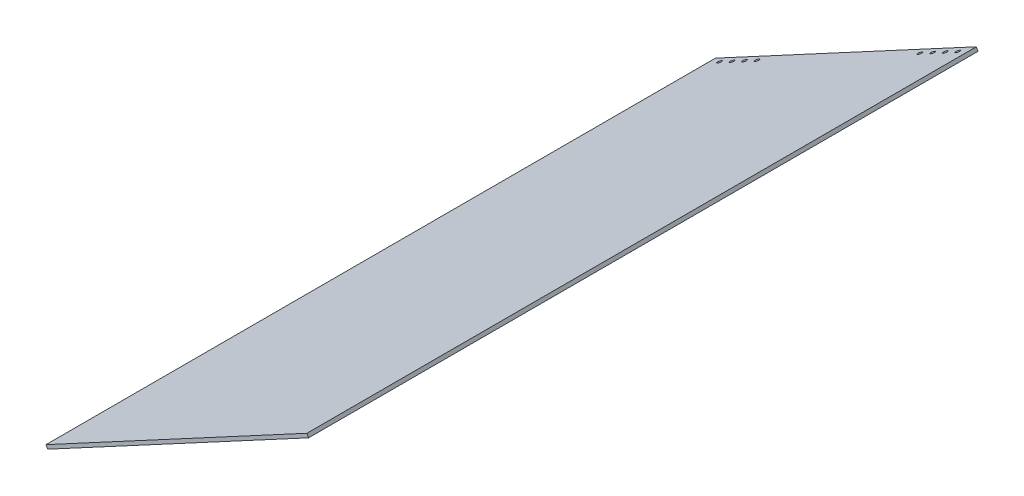
ISO-10303-21;
HEADER;
FILE_DESCRIPTION(('STEP AP214'),'2;1');
FILE_NAME('part.step','',(''),(''),'','','');
FILE_SCHEMA(('AUTOMOTIVE_DESIGN { 1 0 10303 214 1 1 1 1 }'));
ENDSEC;
DATA;
#1=APPLICATION_CONTEXT('core data for automotive mechanical design processes');
#2=APPLICATION_PROTOCOL_DEFINITION('international standard','automotive_design',2000,#1);
#3=PRODUCT_CONTEXT('',#1,'mechanical');
#4=PRODUCT('Part','Part','',(#3));
#5=PRODUCT_RELATED_PRODUCT_CATEGORY('part','',(#4));
#6=PRODUCT_DEFINITION_FORMATION('','',#4);
#7=PRODUCT_DEFINITION_CONTEXT('part definition',#1,'design');
#8=PRODUCT_DEFINITION('design','',#6,#7);
#9=PRODUCT_DEFINITION_SHAPE('','',#8);
#10=(LENGTH_UNIT() NAMED_UNIT(*) SI_UNIT(.MILLI.,.METRE.));
#11=(NAMED_UNIT(*) PLANE_ANGLE_UNIT() SI_UNIT($,.RADIAN.));
#12=(NAMED_UNIT(*) SI_UNIT($,.STERADIAN.) SOLID_ANGLE_UNIT());
#13=UNCERTAINTY_MEASURE_WITH_UNIT(LENGTH_MEASURE(1.E-05),#10,'distance_accuracy_value','');
#14=(GEOMETRIC_REPRESENTATION_CONTEXT(3) GLOBAL_UNCERTAINTY_ASSIGNED_CONTEXT((#13)) GLOBAL_UNIT_ASSIGNED_CONTEXT((#10,
#11,#12)) REPRESENTATION_CONTEXT('',''));
#15=CARTESIAN_POINT('',(0.,0.,0.));
#16=DIRECTION('',(0.,0.,1.));
#17=DIRECTION('',(1.,0.,0.));
#18=AXIS2_PLACEMENT_3D('',#15,#16,#17);
#19=CARTESIAN_POINT('',(-84.4308480260664,85.5814821604404,596.9));
#20=DIRECTION('',(0.880733896749151,0.473611447409219,0.));
#21=DIRECTION('',(-0.473611447409219,0.880733896749151,0.));
#22=AXIS2_PLACEMENT_3D('',#19,#20,#21);
#23=PLANE('',#22);
#24=DIRECTION('',(0.473611447409219,-0.880733896749151,0.));
#25=VECTOR('',#24,1.);
#26=CARTESIAN_POINT('',(-84.4308480260664,85.5814821604404,0.));
#27=LINE('',#26,#25);
#28=CARTESIAN_POINT('',(-85.9345643715907,88.3778122826189,0.));
#29=VERTEX_POINT('',#28);
#30=CARTESIAN_POINT('',(-84.4308480260664,85.5814821604404,0.));
#31=VERTEX_POINT('',#30);
#32=EDGE_CURVE('E102',#29,#31,#27,.T.);
#33=ORIENTED_EDGE('',*,*,#32,.T.);
#34=DIRECTION('',(0.,0.,-1.));
#35=VECTOR('',#34,1.);
#36=CARTESIAN_POINT('',(-84.4308480260664,85.5814821604404,596.9));
#37=LINE('',#36,#35);
#38=CARTESIAN_POINT('',(-84.4308480260664,85.5814821604404,596.9));
#39=VERTEX_POINT('',#38);
#40=EDGE_CURVE('E11',#39,#31,#37,.T.);
#41=ORIENTED_EDGE('',*,*,#40,.F.);
#42=DIRECTION('',(0.473611447409219,-0.880733896749151,0.));
#43=VECTOR('',#42,1.);
#44=CARTESIAN_POINT('',(-84.4308480260664,85.5814821604404,596.9));
#45=LINE('',#44,#43);
#46=CARTESIAN_POINT('',(-85.9345643715907,88.3778122826189,596.9));
#47=VERTEX_POINT('',#46);
#48=EDGE_CURVE('E90',#47,#39,#45,.T.);
#49=ORIENTED_EDGE('',*,*,#48,.F.);
#50=DIRECTION('',(0.,0.,-1.));
#51=VECTOR('',#50,1.);
#52=CARTESIAN_POINT('',(-85.9345643715907,88.3778122826189,596.9));
#53=LINE('',#52,#51);
#54=EDGE_CURVE('E98',#47,#29,#53,.T.);
#55=ORIENTED_EDGE('',*,*,#54,.T.);
#56=EDGE_LOOP('',(#33,#41,#49,#55));
#57=FACE_BOUND('',#56,.T.);
#58=ADVANCED_FACE('F39',(#57),#23,.F.);
#59=CARTESIAN_POINT('',(148.196014482998,210.675730793136,596.9));
#60=DIRECTION('',(-0.473611447409211,0.880733896749155,0.));
#61=DIRECTION('',(-0.880733896749156,-0.473611447409211,0.));
#62=AXIS2_PLACEMENT_3D('',#59,#60,#61);
#63=PLANE('',#62);
#64=CARTESIAN_POINT('',(-52.007320436894,103.017116111059,6.47699999999999));
#65=DIRECTION('',(-0.473611447409211,0.880733896749155,0.));
#66=DIRECTION('',(-0.880733896749156,-0.473611447409211,0.));
#67=AXIS2_PLACEMENT_3D('',#64,#65,#66);
#68=CIRCLE('',#67,2.01930000000001);
#69=CARTESIAN_POINT('',(-53.7857863945996,102.060752515306,6.47699999999999));
#70=VERTEX_POINT('',#69);
#71=EDGE_CURVE('E105',#70,#70,#68,.T.);
#72=ORIENTED_EDGE('',*,*,#71,.T.);
#73=EDGE_LOOP('',(#72));
#74=FACE_BOUND('',#73,.T.);
#75=CARTESIAN_POINT('',(138.143127871249,205.269827606708,6.47699999999999));
#76=DIRECTION('',(-0.473611447409211,0.880733896749155,0.));
#77=DIRECTION('',(-0.880733896749156,-0.473611447409211,0.));
#78=AXIS2_PLACEMENT_3D('',#75,#76,#77);
#79=CIRCLE('',#78,2.01929999999998);
#80=CARTESIAN_POINT('',(136.364661913543,204.313464010954,6.47699999999999));
#81=VERTEX_POINT('',#80);
#82=EDGE_CURVE('E118',#81,#81,#79,.T.);
#83=ORIENTED_EDGE('',*,*,#82,.T.);
#84=EDGE_LOOP('',(#83));
#85=FACE_BOUND('',#84,.T.);
#86=CARTESIAN_POINT('',(115.77248689382,193.240096842514,6.47699999999999));
#87=DIRECTION('',(-0.473611447409211,0.880733896749155,0.));
#88=DIRECTION('',(-0.880733896749156,-0.473611447409211,0.));
#89=AXIS2_PLACEMENT_3D('',#86,#87,#88);
#90=CIRCLE('',#89,2.01929999999998);
#91=CARTESIAN_POINT('',(113.994020936114,192.283733246761,6.47699999999999));
#92=VERTEX_POINT('',#91);
#93=EDGE_CURVE('E121',#92,#92,#90,.T.);
#94=ORIENTED_EDGE('',*,*,#93,.T.);
#95=EDGE_LOOP('',(#94));
#96=FACE_BOUND('',#95,.T.);
#97=CARTESIAN_POINT('',(104.587166405106,187.225231460417,6.47699999999999));
#98=DIRECTION('',(-0.473611447409211,0.880733896749155,0.));
#99=DIRECTION('',(-0.880733896749156,-0.473611447409211,0.));
#100=AXIS2_PLACEMENT_3D('',#97,#98,#99);
#101=CIRCLE('',#100,2.01929999999998);
#102=CARTESIAN_POINT('',(102.8087004474,186.268867864664,6.47699999999999));
#103=VERTEX_POINT('',#102);
#104=EDGE_CURVE('E124',#103,#103,#101,.T.);
#105=ORIENTED_EDGE('',*,*,#104,.T.);
#106=EDGE_LOOP('',(#105));
#107=FACE_BOUND('',#106,.T.);
#108=CARTESIAN_POINT('',(-40.8219999481798,109.031981493156,6.47699999999999));
#109=DIRECTION('',(-0.473611447409211,0.880733896749155,0.));
#110=DIRECTION('',(-0.880733896749156,-0.473611447409211,0.));
#111=AXIS2_PLACEMENT_3D('',#108,#109,#110);
#112=CIRCLE('',#111,2.01930000000001);
#113=CARTESIAN_POINT('',(-42.6004659058854,108.075617897403,6.47699999999999));
#114=VERTEX_POINT('',#113);
#115=EDGE_CURVE('E127',#114,#114,#112,.T.);
#116=ORIENTED_EDGE('',*,*,#115,.T.);
#117=EDGE_LOOP('',(#116));
#118=FACE_BOUND('',#117,.T.);
#119=CARTESIAN_POINT('',(-63.1926409256083,97.0022507289622,6.477));
#120=DIRECTION('',(-0.473611447409211,0.880733896749155,0.));
#121=DIRECTION('',(-0.880733896749156,-0.473611447409211,0.));
#122=AXIS2_PLACEMENT_3D('',#119,#120,#121);
#123=CIRCLE('',#122,2.01929999999997);
#124=CARTESIAN_POINT('',(-64.9711068833139,96.0458871332088,6.477));
#125=VERTEX_POINT('',#124);
#126=EDGE_CURVE('E130',#125,#125,#123,.T.);
#127=ORIENTED_EDGE('',*,*,#126,.T.);
#128=EDGE_LOOP('',(#127));
#129=FACE_BOUND('',#128,.T.);
#130=CARTESIAN_POINT('',(-74.3779614143226,90.9873853468653,6.47700000000001));
#131=DIRECTION('',(-0.473611447409211,0.880733896749155,0.));
#132=DIRECTION('',(-0.880733896749156,-0.473611447409211,0.));
#133=AXIS2_PLACEMENT_3D('',#130,#131,#132);
#134=CIRCLE('',#133,2.01929999999998);
#135=CARTESIAN_POINT('',(-76.1564273720282,90.0310217511118,6.47700000000001));
#136=VERTEX_POINT('',#135);
#137=EDGE_CURVE('E133',#136,#136,#134,.T.);
#138=ORIENTED_EDGE('',*,*,#137,.T.);
#139=EDGE_LOOP('',(#138));
#140=FACE_BOUND('',#139,.T.);
#141=CARTESIAN_POINT('',(126.957807382534,199.254962224611,6.47699999999999));
#142=DIRECTION('',(-0.473611447409211,0.880733896749155,0.));
#143=DIRECTION('',(-0.880733896749156,-0.473611447409211,0.));
#144=AXIS2_PLACEMENT_3D('',#141,#142,#143);
#145=CIRCLE('',#144,2.01930000000001);
#146=CARTESIAN_POINT('',(125.179341424829,198.298598628857,6.47699999999999));
#147=VERTEX_POINT('',#146);
#148=EDGE_CURVE('E136',#147,#147,#145,.T.);
#149=ORIENTED_EDGE('',*,*,#148,.T.);
#150=EDGE_LOOP('',(#149));
#151=FACE_BOUND('',#150,.T.);
#152=DIRECTION('',(0.880733896749155,0.473611447409211,0.));
#153=VECTOR('',#152,1.);
#154=CARTESIAN_POINT('',(148.196014482998,210.675730793136,0.));
#155=LINE('',#154,#153);
#156=CARTESIAN_POINT('',(148.196014482998,210.675730793136,0.));
#157=VERTEX_POINT('',#156);
#158=EDGE_CURVE('E94',#31,#157,#155,.T.);
#159=ORIENTED_EDGE('',*,*,#158,.T.);
#160=DIRECTION('',(0.,0.,-1.));
#161=VECTOR('',#160,1.);
#162=CARTESIAN_POINT('',(148.196014482998,210.675730793136,596.9));
#163=LINE('',#162,#161);
#164=CARTESIAN_POINT('',(148.196014482998,210.675730793136,596.9));
#165=VERTEX_POINT('',#164);
#166=EDGE_CURVE('E47',#165,#157,#163,.T.);
#167=ORIENTED_EDGE('',*,*,#166,.F.);
#168=DIRECTION('',(0.880733896749155,0.473611447409211,0.));
#169=VECTOR('',#168,1.);
#170=CARTESIAN_POINT('',(148.196014482998,210.675730793136,596.9));
#171=LINE('',#170,#169);
#172=EDGE_CURVE('E85',#39,#165,#171,.T.);
#173=ORIENTED_EDGE('',*,*,#172,.F.);
#174=ORIENTED_EDGE('',*,*,#40,.T.);
#175=EDGE_LOOP('',(#159,#167,#173,#174));
#176=FACE_BOUND('',#175,.T.);
#177=ADVANCED_FACE('F93',(#74,#85,#96,#107,#118,#129,#140,#151,#176),#63,.F.);
#178=CARTESIAN_POINT('',(146.692298137474,213.472060915314,596.9));
#179=DIRECTION('',(-0.880733896749156,-0.47361144740921,0.));
#180=DIRECTION('',(0.47361144740921,-0.880733896749156,0.));
#181=AXIS2_PLACEMENT_3D('',#178,#179,#180);
#182=PLANE('',#181);
#183=DIRECTION('',(-0.47361144740921,0.880733896749156,0.));
#184=VECTOR('',#183,1.);
#185=CARTESIAN_POINT('',(146.692298137474,213.472060915314,0.));
#186=LINE('',#185,#184);
#187=CARTESIAN_POINT('',(146.692298137474,213.472060915314,0.));
#188=VERTEX_POINT('',#187);
#189=EDGE_CURVE('E72',#157,#188,#186,.T.);
#190=ORIENTED_EDGE('',*,*,#189,.T.);
#191=DIRECTION('',(0.,0.,-1.));
#192=VECTOR('',#191,1.);
#193=CARTESIAN_POINT('',(146.692298137474,213.472060915314,596.9));
#194=LINE('',#193,#192);
#195=CARTESIAN_POINT('',(146.692298137474,213.472060915314,596.9));
#196=VERTEX_POINT('',#195);
#197=EDGE_CURVE('E95',#196,#188,#194,.T.);
#198=ORIENTED_EDGE('',*,*,#197,.F.);
#199=DIRECTION('',(-0.47361144740921,0.880733896749156,0.));
#200=VECTOR('',#199,1.);
#201=CARTESIAN_POINT('',(146.692298137474,213.472060915314,596.9));
#202=LINE('',#201,#200);
#203=EDGE_CURVE('E88',#165,#196,#202,.T.);
#204=ORIENTED_EDGE('',*,*,#203,.F.);
#205=ORIENTED_EDGE('',*,*,#166,.T.);
#206=EDGE_LOOP('',(#190,#198,#204,#205));
#207=FACE_BOUND('',#206,.T.);
#208=ADVANCED_FACE('F96',(#207),#182,.F.);
#209=CARTESIAN_POINT('',(-85.9345643715907,88.3778122826189,596.9));
#210=DIRECTION('',(0.473611447409211,-0.880733896749156,0.));
#211=DIRECTION('',(0.880733896749156,0.473611447409211,0.));
#212=AXIS2_PLACEMENT_3D('',#209,#210,#211);
#213=PLANE('',#212);
#214=CARTESIAN_POINT('',(-53.5110367824183,105.813446233238,6.47699999999999));
#215=DIRECTION('',(-0.473611447409203,0.88073389674916,0.));
#216=DIRECTION('',(-0.88073389674916,-0.473611447409203,0.));
#217=AXIS2_PLACEMENT_3D('',#214,#215,#216);
#218=CIRCLE('',#217,2.01930000000001);
#219=CARTESIAN_POINT('',(-55.2895027401238,104.857082637484,6.47699999999999));
#220=VERTEX_POINT('',#219);
#221=EDGE_CURVE('E149',#220,#220,#218,.T.);
#222=ORIENTED_EDGE('',*,*,#221,.F.);
#223=EDGE_LOOP('',(#222));
#224=FACE_BOUND('',#223,.T.);
#225=CARTESIAN_POINT('',(136.639411525725,208.066157728885,6.47699999999999));
#226=DIRECTION('',(-0.473611447409203,0.88073389674916,0.));
#227=DIRECTION('',(-0.88073389674916,-0.473611447409203,0.));
#228=AXIS2_PLACEMENT_3D('',#225,#226,#227);
#229=CIRCLE('',#228,2.01929999999998);
#230=CARTESIAN_POINT('',(134.86094556802,207.109794133131,6.47699999999999));
#231=VERTEX_POINT('',#230);
#232=EDGE_CURVE('E148',#231,#231,#229,.T.);
#233=ORIENTED_EDGE('',*,*,#232,.F.);
#234=EDGE_LOOP('',(#233));
#235=FACE_BOUND('',#234,.T.);
#236=CARTESIAN_POINT('',(114.268770548297,196.036426964691,6.47699999999999));
#237=DIRECTION('',(-0.473611447409203,0.88073389674916,0.));
#238=DIRECTION('',(-0.88073389674916,-0.473611447409203,0.));
#239=AXIS2_PLACEMENT_3D('',#236,#237,#238);
#240=CIRCLE('',#239,2.01929999999998);
#241=CARTESIAN_POINT('',(112.490304590591,195.080063368937,6.47699999999999));
#242=VERTEX_POINT('',#241);
#243=EDGE_CURVE('E142',#242,#242,#240,.T.);
#244=ORIENTED_EDGE('',*,*,#243,.F.);
#245=EDGE_LOOP('',(#244));
#246=FACE_BOUND('',#245,.T.);
#247=CARTESIAN_POINT('',(103.083450059582,190.021561582594,6.47699999999999));
#248=DIRECTION('',(-0.473611447409203,0.88073389674916,0.));
#249=DIRECTION('',(-0.88073389674916,-0.473611447409203,0.));
#250=AXIS2_PLACEMENT_3D('',#247,#248,#249);
#251=CIRCLE('',#250,2.01929999999998);
#252=CARTESIAN_POINT('',(101.304984101877,189.065197986841,6.47699999999999));
#253=VERTEX_POINT('',#252);
#254=EDGE_CURVE('E145',#253,#253,#251,.T.);
#255=ORIENTED_EDGE('',*,*,#254,.F.);
#256=EDGE_LOOP('',(#255));
#257=FACE_BOUND('',#256,.T.);
#258=CARTESIAN_POINT('',(-42.3257162937039,111.828311615335,6.47699999999999));
#259=DIRECTION('',(-0.473611447409203,0.88073389674916,0.));
#260=DIRECTION('',(-0.88073389674916,-0.473611447409203,0.));
#261=AXIS2_PLACEMENT_3D('',#258,#259,#260);
#262=CIRCLE('',#261,2.01930000000001);
#263=CARTESIAN_POINT('',(-44.1041822514095,110.871948019581,6.47699999999999));
#264=VERTEX_POINT('',#263);
#265=EDGE_CURVE('E160',#264,#264,#262,.T.);
#266=ORIENTED_EDGE('',*,*,#265,.F.);
#267=EDGE_LOOP('',(#266));
#268=FACE_BOUND('',#267,.T.);
#269=CARTESIAN_POINT('',(-64.6963572711326,99.7985808511409,6.477));
#270=DIRECTION('',(-0.473611447409203,0.88073389674916,0.));
#271=DIRECTION('',(-0.88073389674916,-0.473611447409203,0.));
#272=AXIS2_PLACEMENT_3D('',#269,#270,#271);
#273=CIRCLE('',#272,2.01929999999997);
#274=CARTESIAN_POINT('',(-66.4748232288381,98.8422172553875,6.477));
#275=VERTEX_POINT('',#274);
#276=EDGE_CURVE('E152',#275,#275,#273,.T.);
#277=ORIENTED_EDGE('',*,*,#276,.F.);
#278=EDGE_LOOP('',(#277));
#279=FACE_BOUND('',#278,.T.);
#280=CARTESIAN_POINT('',(-75.8816777598469,93.783715469044,6.47700000000001));
#281=DIRECTION('',(-0.473611447409203,0.88073389674916,0.));
#282=DIRECTION('',(-0.88073389674916,-0.473611447409203,0.));
#283=AXIS2_PLACEMENT_3D('',#280,#281,#282);
#284=CIRCLE('',#283,2.01929999999998);
#285=CARTESIAN_POINT('',(-77.6601437175525,92.8273518732906,6.47700000000001));
#286=VERTEX_POINT('',#285);
#287=EDGE_CURVE('E157',#286,#286,#284,.T.);
#288=ORIENTED_EDGE('',*,*,#287,.F.);
#289=EDGE_LOOP('',(#288));
#290=FACE_BOUND('',#289,.T.);
#291=CARTESIAN_POINT('',(125.454091037011,202.051292346788,6.47699999999999));
#292=DIRECTION('',(-0.473611447409203,0.88073389674916,0.));
#293=DIRECTION('',(-0.88073389674916,-0.473611447409203,0.));
#294=AXIS2_PLACEMENT_3D('',#291,#292,#293);
#295=CIRCLE('',#294,2.01930000000001);
#296=CARTESIAN_POINT('',(123.675625079305,201.094928751034,6.47699999999999));
#297=VERTEX_POINT('',#296);
#298=EDGE_CURVE('E139',#297,#297,#295,.T.);
#299=ORIENTED_EDGE('',*,*,#298,.F.);
#300=EDGE_LOOP('',(#299));
#301=FACE_BOUND('',#300,.T.);
#302=DIRECTION('',(-0.880733896749155,-0.473611447409211,0.));
#303=VECTOR('',#302,1.);
#304=CARTESIAN_POINT('',(-85.9345643715907,88.3778122826189,0.));
#305=LINE('',#304,#303);
#306=EDGE_CURVE('E78',#188,#29,#305,.T.);
#307=ORIENTED_EDGE('',*,*,#306,.T.);
#308=ORIENTED_EDGE('',*,*,#54,.F.);
#309=DIRECTION('',(-0.880733896749155,-0.473611447409211,0.));
#310=VECTOR('',#309,1.);
#311=CARTESIAN_POINT('',(-85.9345643715907,88.3778122826189,596.9));
#312=LINE('',#311,#310);
#313=EDGE_CURVE('E55',#196,#47,#312,.T.);
#314=ORIENTED_EDGE('',*,*,#313,.F.);
#315=ORIENTED_EDGE('',*,*,#197,.T.);
#316=EDGE_LOOP('',(#307,#308,#314,#315));
#317=FACE_BOUND('',#316,.T.);
#318=ADVANCED_FACE('F110',(#224,#235,#246,#257,#268,#279,#290,#301,#317),#213,.F.);
#319=CARTESIAN_POINT('',(0.,0.,596.9));
#320=DIRECTION('',(0.,0.,-1.));
#321=DIRECTION('',(-1.,0.,0.));
#322=AXIS2_PLACEMENT_3D('',#319,#320,#321);
#323=PLANE('',#322);
#324=ORIENTED_EDGE('',*,*,#48,.T.);
#325=ORIENTED_EDGE('',*,*,#172,.T.);
#326=ORIENTED_EDGE('',*,*,#203,.T.);
#327=ORIENTED_EDGE('',*,*,#313,.T.);
#328=EDGE_LOOP('',(#324,#325,#326,#327));
#329=FACE_BOUND('',#328,.T.);
#330=ADVANCED_FACE('F86',(#329),#323,.F.);
#331=CARTESIAN_POINT('',(0.,0.,0.));
#332=DIRECTION('',(0.,0.,-1.));
#333=DIRECTION('',(-1.,0.,0.));
#334=AXIS2_PLACEMENT_3D('',#331,#332,#333);
#335=PLANE('',#334);
#336=ORIENTED_EDGE('',*,*,#32,.F.);
#337=ORIENTED_EDGE('',*,*,#306,.F.);
#338=ORIENTED_EDGE('',*,*,#189,.F.);
#339=ORIENTED_EDGE('',*,*,#158,.F.);
#340=EDGE_LOOP('',(#336,#337,#338,#339));
#341=FACE_BOUND('',#340,.T.);
#342=ADVANCED_FACE('F113',(#341),#335,.T.);
#343=CARTESIAN_POINT('',(179.137827857953,102.220329685292,6.47699999999999));
#344=DIRECTION('',(-0.473611447409203,0.88073389674916,0.));
#345=DIRECTION('',(-0.88073389674916,-0.473611447409203,0.));
#346=AXIS2_PLACEMENT_3D('',#343,#344,#345);
#347=CYLINDRICAL_SURFACE('',#346,2.01930000000001);
#348=ORIENTED_EDGE('',*,*,#298,.T.);
#349=EDGE_LOOP('',(#348));
#350=FACE_BOUND('',#349,.T.);
#351=ORIENTED_EDGE('',*,*,#148,.F.);
#352=EDGE_LOOP('',(#351));
#353=FACE_BOUND('',#352,.T.);
#354=ADVANCED_FACE('F177',(#350,#353),#347,.F.);
#355=CARTESIAN_POINT('',(-22.1979409389046,-6.04724719245137,6.47700000000001));
#356=DIRECTION('',(-0.473611447409203,0.88073389674916,0.));
#357=DIRECTION('',(-0.88073389674916,-0.473611447409203,0.));
#358=AXIS2_PLACEMENT_3D('',#355,#356,#357);
#359=CYLINDRICAL_SURFACE('',#358,2.01929999999998);
#360=ORIENTED_EDGE('',*,*,#287,.T.);
#361=EDGE_LOOP('',(#360));
#362=FACE_BOUND('',#361,.T.);
#363=ORIENTED_EDGE('',*,*,#137,.F.);
#364=EDGE_LOOP('',(#363));
#365=FACE_BOUND('',#364,.T.);
#366=ADVANCED_FACE('F180',(#362,#365),#359,.F.);
#367=CARTESIAN_POINT('',(-11.0126204501902,-0.0323818103544898,6.477));
#368=DIRECTION('',(-0.473611447409203,0.88073389674916,0.));
#369=DIRECTION('',(-0.88073389674916,-0.473611447409203,0.));
#370=AXIS2_PLACEMENT_3D('',#367,#368,#369);
#371=CYLINDRICAL_SURFACE('',#370,2.01929999999997);
#372=ORIENTED_EDGE('',*,*,#276,.T.);
#373=EDGE_LOOP('',(#372));
#374=FACE_BOUND('',#373,.T.);
#375=ORIENTED_EDGE('',*,*,#126,.F.);
#376=EDGE_LOOP('',(#375));
#377=FACE_BOUND('',#376,.T.);
#378=ADVANCED_FACE('F213',(#374,#377),#371,.F.);
#379=CARTESIAN_POINT('',(11.3580205272384,11.9973489538393,6.47699999999999));
#380=DIRECTION('',(-0.473611447409203,0.88073389674916,0.));
#381=DIRECTION('',(-0.88073389674916,-0.473611447409203,0.));
#382=AXIS2_PLACEMENT_3D('',#379,#380,#381);
#383=CYLINDRICAL_SURFACE('',#382,2.01930000000001);
#384=ORIENTED_EDGE('',*,*,#265,.T.);
#385=EDGE_LOOP('',(#384));
#386=FACE_BOUND('',#385,.T.);
#387=ORIENTED_EDGE('',*,*,#115,.F.);
#388=EDGE_LOOP('',(#387));
#389=FACE_BOUND('',#388,.T.);
#390=ADVANCED_FACE('F164',(#386,#389),#383,.F.);
#391=CARTESIAN_POINT('',(156.767186880525,90.1905989210986,6.47699999999999));
#392=DIRECTION('',(-0.473611447409203,0.88073389674916,0.));
#393=DIRECTION('',(-0.88073389674916,-0.473611447409203,0.));
#394=AXIS2_PLACEMENT_3D('',#391,#392,#393);
#395=CYLINDRICAL_SURFACE('',#394,2.01929999999998);
#396=ORIENTED_EDGE('',*,*,#254,.T.);
#397=EDGE_LOOP('',(#396));
#398=FACE_BOUND('',#397,.T.);
#399=ORIENTED_EDGE('',*,*,#104,.F.);
#400=EDGE_LOOP('',(#399));
#401=FACE_BOUND('',#400,.T.);
#402=ADVANCED_FACE('F201',(#398,#401),#395,.F.);
#403=CARTESIAN_POINT('',(167.952507369239,96.2054643031955,6.47699999999999));
#404=DIRECTION('',(-0.473611447409203,0.88073389674916,0.));
#405=DIRECTION('',(-0.88073389674916,-0.473611447409203,0.));
#406=AXIS2_PLACEMENT_3D('',#403,#404,#405);
#407=CYLINDRICAL_SURFACE('',#406,2.01929999999998);
#408=ORIENTED_EDGE('',*,*,#243,.T.);
#409=EDGE_LOOP('',(#408));
#410=FACE_BOUND('',#409,.T.);
#411=ORIENTED_EDGE('',*,*,#93,.F.);
#412=EDGE_LOOP('',(#411));
#413=FACE_BOUND('',#412,.T.);
#414=ADVANCED_FACE('F197',(#410,#413),#407,.F.);
#415=CARTESIAN_POINT('',(190.323148346668,108.235195067389,6.47699999999999));
#416=DIRECTION('',(-0.473611447409203,0.88073389674916,0.));
#417=DIRECTION('',(-0.88073389674916,-0.473611447409203,0.));
#418=AXIS2_PLACEMENT_3D('',#415,#416,#417);
#419=CYLINDRICAL_SURFACE('',#418,2.01929999999998);
#420=ORIENTED_EDGE('',*,*,#232,.T.);
#421=EDGE_LOOP('',(#420));
#422=FACE_BOUND('',#421,.T.);
#423=ORIENTED_EDGE('',*,*,#82,.F.);
#424=EDGE_LOOP('',(#423));
#425=FACE_BOUND('',#424,.T.);
#426=ADVANCED_FACE('F200',(#422,#425),#419,.F.);
#427=CARTESIAN_POINT('',(0.172700038524078,5.98248357174239,6.47699999999999));
#428=DIRECTION('',(-0.473611447409203,0.88073389674916,0.));
#429=DIRECTION('',(-0.88073389674916,-0.473611447409203,0.));
#430=AXIS2_PLACEMENT_3D('',#427,#428,#429);
#431=CYLINDRICAL_SURFACE('',#430,2.01930000000001);
#432=ORIENTED_EDGE('',*,*,#221,.T.);
#433=EDGE_LOOP('',(#432));
#434=FACE_BOUND('',#433,.T.);
#435=ORIENTED_EDGE('',*,*,#71,.F.);
#436=EDGE_LOOP('',(#435));
#437=FACE_BOUND('',#436,.T.);
#438=ADVANCED_FACE('F206',(#434,#437),#431,.F.);
#439=CLOSED_SHELL('',(#58,#177,#208,#318,#330,#342,#354,#366,#378,#390,#402,#414,#426,#438));
#440=MANIFOLD_SOLID_BREP('B2',#439);
#441=ADVANCED_BREP_SHAPE_REPRESENTATION('',(#18,#440),#14);
#442=SHAPE_DEFINITION_REPRESENTATION(#9,#441);
ENDSEC;
END-ISO-10303-21;
